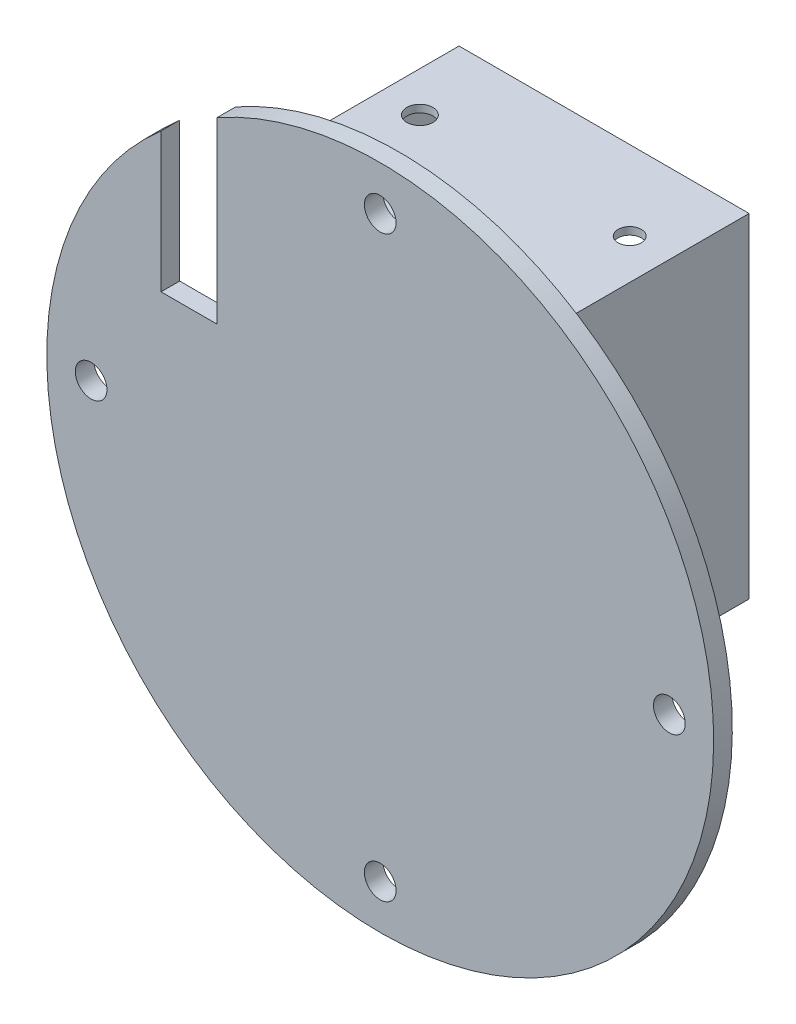
ISO-10303-21;
HEADER;
FILE_DESCRIPTION(('STEP AP214'),'2;1');
FILE_NAME('part.step','',(''),(''),'','','');
FILE_SCHEMA(('AUTOMOTIVE_DESIGN { 1 0 10303 214 1 1 1 1 }'));
ENDSEC;
DATA;
#1=APPLICATION_CONTEXT('core data for automotive mechanical design processes');
#2=APPLICATION_PROTOCOL_DEFINITION('international standard','automotive_design',2000,#1);
#3=PRODUCT_CONTEXT('',#1,'mechanical');
#4=PRODUCT('Part','Part','',(#3));
#5=PRODUCT_RELATED_PRODUCT_CATEGORY('part','',(#4));
#6=PRODUCT_DEFINITION_FORMATION('','',#4);
#7=PRODUCT_DEFINITION_CONTEXT('part definition',#1,'design');
#8=PRODUCT_DEFINITION('design','',#6,#7);
#9=PRODUCT_DEFINITION_SHAPE('','',#8);
#10=(LENGTH_UNIT() NAMED_UNIT(*) SI_UNIT(.MILLI.,.METRE.));
#11=(NAMED_UNIT(*) PLANE_ANGLE_UNIT() SI_UNIT($,.RADIAN.));
#12=(NAMED_UNIT(*) SI_UNIT($,.STERADIAN.) SOLID_ANGLE_UNIT());
#13=UNCERTAINTY_MEASURE_WITH_UNIT(LENGTH_MEASURE(1.E-05),#10,'distance_accuracy_value','');
#14=(GEOMETRIC_REPRESENTATION_CONTEXT(3) GLOBAL_UNCERTAINTY_ASSIGNED_CONTEXT((#13)) GLOBAL_UNIT_ASSIGNED_CONTEXT((#10,
#11,#12)) REPRESENTATION_CONTEXT('',''));
#15=CARTESIAN_POINT('',(0.,0.,0.));
#16=DIRECTION('',(0.,0.,1.));
#17=DIRECTION('',(1.,0.,0.));
#18=AXIS2_PLACEMENT_3D('',#15,#16,#17);
#19=CARTESIAN_POINT('',(0.,0.,0.));
#20=DIRECTION('',(0.,0.,1.));
#21=DIRECTION('',(1.,0.,0.));
#22=AXIS2_PLACEMENT_3D('',#19,#20,#21);
#23=PLANE('',#22);
#24=CARTESIAN_POINT('',(-31.,0.,0.));
#25=DIRECTION('',(0.,0.,1.));
#26=DIRECTION('',(1.,0.,0.));
#27=AXIS2_PLACEMENT_3D('',#24,#25,#26);
#28=CIRCLE('',#27,1.7);
#29=CARTESIAN_POINT('',(-29.3,0.,0.));
#30=VERTEX_POINT('',#29);
#31=EDGE_CURVE('E203',#30,#30,#28,.T.);
#32=ORIENTED_EDGE('',*,*,#31,.T.);
#33=EDGE_LOOP('',(#32));
#34=FACE_BOUND('',#33,.T.);
#35=CARTESIAN_POINT('',(31.,0.,0.));
#36=DIRECTION('',(0.,0.,1.));
#37=DIRECTION('',(1.,0.,0.));
#38=AXIS2_PLACEMENT_3D('',#35,#36,#37);
#39=CIRCLE('',#38,1.7);
#40=CARTESIAN_POINT('',(32.7,0.,0.));
#41=VERTEX_POINT('',#40);
#42=EDGE_CURVE('E199',#41,#41,#39,.F.);
#43=ORIENTED_EDGE('',*,*,#42,.F.);
#44=EDGE_LOOP('',(#43));
#45=FACE_BOUND('',#44,.T.);
#46=CARTESIAN_POINT('',(0.,-31.,0.));
#47=DIRECTION('',(0.,0.,1.));
#48=DIRECTION('',(1.,0.,0.));
#49=AXIS2_PLACEMENT_3D('',#46,#47,#48);
#50=CIRCLE('',#49,1.7);
#51=CARTESIAN_POINT('',(1.70000000000001,-31.,0.));
#52=VERTEX_POINT('',#51);
#53=EDGE_CURVE('E184',#52,#52,#50,.F.);
#54=ORIENTED_EDGE('',*,*,#53,.F.);
#55=EDGE_LOOP('',(#54));
#56=FACE_BOUND('',#55,.T.);
#57=DIRECTION('',(0.,1.,0.));
#58=VECTOR('',#57,1.);
#59=CARTESIAN_POINT('',(-15.55,-9.,0.));
#60=LINE('',#59,#58);
#61=CARTESIAN_POINT('',(-15.55,-9.,0.));
#62=VERTEX_POINT('',#61);
#63=CARTESIAN_POINT('',(-15.55,26.8,0.));
#64=VERTEX_POINT('',#63);
#65=EDGE_CURVE('E275',#62,#64,#60,.T.);
#66=ORIENTED_EDGE('',*,*,#65,.F.);
#67=DIRECTION('',(-1.,0.,0.));
#68=VECTOR('',#67,1.);
#69=CARTESIAN_POINT('',(14.75,-9.00000000000001,0.));
#70=LINE('',#69,#68);
#71=CARTESIAN_POINT('',(15.55,-9.00000000000001,0.));
#72=VERTEX_POINT('',#71);
#73=EDGE_CURVE('E67',#72,#62,#70,.T.);
#74=ORIENTED_EDGE('',*,*,#73,.F.);
#75=DIRECTION('',(0.,-1.,0.));
#76=VECTOR('',#75,1.);
#77=CARTESIAN_POINT('',(15.55,26.8,0.));
#78=LINE('',#77,#76);
#79=CARTESIAN_POINT('',(15.55,26.8,0.));
#80=VERTEX_POINT('',#79);
#81=EDGE_CURVE('E251',#80,#72,#78,.T.);
#82=ORIENTED_EDGE('',*,*,#81,.F.);
#83=DIRECTION('',(1.,0.,0.));
#84=VECTOR('',#83,1.);
#85=CARTESIAN_POINT('',(-15.55,26.8,0.));
#86=LINE('',#85,#84);
#87=EDGE_CURVE('E74',#64,#80,#86,.T.);
#88=ORIENTED_EDGE('',*,*,#87,.F.);
#89=EDGE_LOOP('',(#66,#74,#82,#88));
#90=FACE_BOUND('',#89,.T.);
#91=DIRECTION('',(0.,-1.,0.));
#92=VECTOR('',#91,1.);
#93=CARTESIAN_POINT('',(-17.5,0.,0.));
#94=LINE('',#93,#92);
#95=CARTESIAN_POINT('',(-17.5,31.1739073585587,0.));
#96=VERTEX_POINT('',#95);
#97=CARTESIAN_POINT('',(-17.5,12.,0.));
#98=VERTEX_POINT('',#97);
#99=EDGE_CURVE('E221',#96,#98,#94,.T.);
#100=ORIENTED_EDGE('',*,*,#99,.F.);
#101=CARTESIAN_POINT('',(0.,0.,0.));
#102=DIRECTION('',(0.,0.,1.));
#103=DIRECTION('',(1.,0.,0.));
#104=AXIS2_PLACEMENT_3D('',#101,#102,#103);
#105=CIRCLE('',#104,35.75);
#106=CARTESIAN_POINT('',(-23.5,26.9409075570961,0.));
#107=VERTEX_POINT('',#106);
#108=EDGE_CURVE('E59',#107,#96,#105,.T.);
#109=ORIENTED_EDGE('',*,*,#108,.F.);
#110=DIRECTION('',(0.,1.,0.));
#111=VECTOR('',#110,1.);
#112=CARTESIAN_POINT('',(-23.5,0.,0.));
#113=LINE('',#112,#111);
#114=CARTESIAN_POINT('',(-23.5,12.,0.));
#115=VERTEX_POINT('',#114);
#116=EDGE_CURVE('E176',#115,#107,#113,.T.);
#117=ORIENTED_EDGE('',*,*,#116,.F.);
#118=DIRECTION('',(-1.,0.,0.));
#119=VECTOR('',#118,1.);
#120=CARTESIAN_POINT('',(0.,12.,0.));
#121=LINE('',#120,#119);
#122=EDGE_CURVE('E218',#98,#115,#121,.T.);
#123=ORIENTED_EDGE('',*,*,#122,.F.);
#124=EDGE_LOOP('',(#100,#109,#117,#123));
#125=FACE_BOUND('',#124,.T.);
#126=CARTESIAN_POINT('',(0.,31.,0.));
#127=DIRECTION('',(0.,0.,1.));
#128=DIRECTION('',(1.,0.,0.));
#129=AXIS2_PLACEMENT_3D('',#126,#127,#128);
#130=CIRCLE('',#129,1.7);
#131=CARTESIAN_POINT('',(1.7,31.,0.));
#132=VERTEX_POINT('',#131);
#133=EDGE_CURVE('E154',#132,#132,#130,.T.);
#134=ORIENTED_EDGE('',*,*,#133,.T.);
#135=EDGE_LOOP('',(#134));
#136=FACE_BOUND('',#135,.T.);
#137=ADVANCED_FACE('F49',(#34,#45,#56,#90,#125,#136),#23,.F.);
#138=CARTESIAN_POINT('',(0.,0.,2.));
#139=DIRECTION('',(0.,0.,1.));
#140=DIRECTION('',(1.,0.,0.));
#141=AXIS2_PLACEMENT_3D('',#138,#139,#140);
#142=PLANE('',#141);
#143=CARTESIAN_POINT('',(0.,0.,2.));
#144=DIRECTION('',(0.,0.,1.));
#145=DIRECTION('',(1.,0.,0.));
#146=AXIS2_PLACEMENT_3D('',#143,#144,#145);
#147=CIRCLE('',#146,35.75);
#148=CARTESIAN_POINT('',(-23.5,26.9409075570961,2.));
#149=VERTEX_POINT('',#148);
#150=CARTESIAN_POINT('',(-17.5,31.1739073585587,2.));
#151=VERTEX_POINT('',#150);
#152=EDGE_CURVE('E11',#149,#151,#147,.T.);
#153=ORIENTED_EDGE('',*,*,#152,.T.);
#154=DIRECTION('',(0.,-1.,0.));
#155=VECTOR('',#154,1.);
#156=CARTESIAN_POINT('',(-17.5,22.,2.));
#157=LINE('',#156,#155);
#158=CARTESIAN_POINT('',(-17.5,12.,2.));
#159=VERTEX_POINT('',#158);
#160=EDGE_CURVE('E142',#151,#159,#157,.T.);
#161=ORIENTED_EDGE('',*,*,#160,.T.);
#162=DIRECTION('',(-1.,0.,0.));
#163=VECTOR('',#162,1.);
#164=CARTESIAN_POINT('',(-17.5,12.,2.));
#165=LINE('',#164,#163);
#166=CARTESIAN_POINT('',(-23.5,12.,2.));
#167=VERTEX_POINT('',#166);
#168=EDGE_CURVE('E153',#159,#167,#165,.T.);
#169=ORIENTED_EDGE('',*,*,#168,.T.);
#170=DIRECTION('',(0.,1.,0.));
#171=VECTOR('',#170,1.);
#172=CARTESIAN_POINT('',(-23.5,12.,2.));
#173=LINE('',#172,#171);
#174=EDGE_CURVE('E167',#167,#149,#173,.T.);
#175=ORIENTED_EDGE('',*,*,#174,.T.);
#176=EDGE_LOOP('',(#153,#161,#169,#175));
#177=FACE_BOUND('',#176,.T.);
#178=CARTESIAN_POINT('',(31.,0.,2.));
#179=DIRECTION('',(0.,0.,1.));
#180=DIRECTION('',(1.,0.,0.));
#181=AXIS2_PLACEMENT_3D('',#178,#179,#180);
#182=CIRCLE('',#181,1.7);
#183=CARTESIAN_POINT('',(32.7,0.,2.));
#184=VERTEX_POINT('',#183);
#185=EDGE_CURVE('E189',#184,#184,#182,.F.);
#186=ORIENTED_EDGE('',*,*,#185,.T.);
#187=EDGE_LOOP('',(#186));
#188=FACE_BOUND('',#187,.T.);
#189=CARTESIAN_POINT('',(0.,-31.,2.));
#190=DIRECTION('',(0.,0.,-1.));
#191=DIRECTION('',(-1.,0.,0.));
#192=AXIS2_PLACEMENT_3D('',#189,#190,#191);
#193=CIRCLE('',#192,1.7);
#194=CARTESIAN_POINT('',(-1.69999999999999,-31.,2.));
#195=VERTEX_POINT('',#194);
#196=EDGE_CURVE('E161',#195,#195,#193,.T.);
#197=ORIENTED_EDGE('',*,*,#196,.T.);
#198=EDGE_LOOP('',(#197));
#199=FACE_BOUND('',#198,.T.);
#200=CARTESIAN_POINT('',(-31.,0.,2.));
#201=DIRECTION('',(0.,0.,1.));
#202=DIRECTION('',(1.,0.,0.));
#203=AXIS2_PLACEMENT_3D('',#200,#201,#202);
#204=CIRCLE('',#203,1.7);
#205=CARTESIAN_POINT('',(-29.3,0.,2.));
#206=VERTEX_POINT('',#205);
#207=EDGE_CURVE('E185',#206,#206,#204,.T.);
#208=ORIENTED_EDGE('',*,*,#207,.F.);
#209=EDGE_LOOP('',(#208));
#210=FACE_BOUND('',#209,.T.);
#211=CARTESIAN_POINT('',(0.,31.,2.));
#212=DIRECTION('',(0.,0.,1.));
#213=DIRECTION('',(1.,0.,0.));
#214=AXIS2_PLACEMENT_3D('',#211,#212,#213);
#215=CIRCLE('',#214,1.7);
#216=CARTESIAN_POINT('',(1.7,31.,2.));
#217=VERTEX_POINT('',#216);
#218=EDGE_CURVE('E180',#217,#217,#215,.T.);
#219=ORIENTED_EDGE('',*,*,#218,.F.);
#220=EDGE_LOOP('',(#219));
#221=FACE_BOUND('',#220,.T.);
#222=ADVANCED_FACE('F164',(#177,#188,#199,#210,#221),#142,.T.);
#223=CARTESIAN_POINT('',(0.,0.,2.));
#224=DIRECTION('',(0.,0.,-1.));
#225=DIRECTION('',(-1.,0.,0.));
#226=AXIS2_PLACEMENT_3D('',#223,#224,#225);
#227=CYLINDRICAL_SURFACE('',#226,35.75);
#228=ORIENTED_EDGE('',*,*,#108,.T.);
#229=DIRECTION('',(0.,0.,-1.));
#230=VECTOR('',#229,1.);
#231=CARTESIAN_POINT('',(-17.5,31.1739073585587,2.));
#232=LINE('',#231,#230);
#233=EDGE_CURVE('E145',#96,#151,#232,.F.);
#234=ORIENTED_EDGE('',*,*,#233,.T.);
#235=ORIENTED_EDGE('',*,*,#152,.F.);
#236=DIRECTION('',(0.,0.,-1.));
#237=VECTOR('',#236,1.);
#238=CARTESIAN_POINT('',(-23.5,26.9409075570961,2.));
#239=LINE('',#238,#237);
#240=EDGE_CURVE('E162',#149,#107,#239,.T.);
#241=ORIENTED_EDGE('',*,*,#240,.T.);
#242=EDGE_LOOP('',(#228,#234,#235,#241));
#243=FACE_BOUND('',#242,.T.);
#244=ADVANCED_FACE('F51',(#243),#227,.T.);
#245=CARTESIAN_POINT('',(14.75,-9.00000000000001,-22.));
#246=DIRECTION('',(0.,1.,0.));
#247=DIRECTION('',(0.,0.,1.));
#248=AXIS2_PLACEMENT_3D('',#245,#246,#247);
#249=PLANE('',#248);
#250=ORIENTED_EDGE('',*,*,#73,.T.);
#251=DIRECTION('',(0.,0.,1.));
#252=VECTOR('',#251,1.);
#253=CARTESIAN_POINT('',(-15.55,-9.,-22.));
#254=LINE('',#253,#252);
#255=CARTESIAN_POINT('',(-15.55,-9.,-22.));
#256=VERTEX_POINT('',#255);
#257=EDGE_CURVE('E293',#256,#62,#254,.T.);
#258=ORIENTED_EDGE('',*,*,#257,.F.);
#259=DIRECTION('',(-1.,0.,0.));
#260=VECTOR('',#259,1.);
#261=CARTESIAN_POINT('',(-14.75,-9.,-22.));
#262=LINE('',#261,#260);
#263=CARTESIAN_POINT('',(-14.75,-9.,-22.));
#264=VERTEX_POINT('',#263);
#265=EDGE_CURVE('E260',#264,#256,#262,.T.);
#266=ORIENTED_EDGE('',*,*,#265,.F.);
#267=DIRECTION('',(0.,0.,1.));
#268=VECTOR('',#267,1.);
#269=CARTESIAN_POINT('',(-14.75,-9.,-22.));
#270=LINE('',#269,#268);
#271=CARTESIAN_POINT('',(-14.75,-9.,-10.));
#272=VERTEX_POINT('',#271);
#273=EDGE_CURVE('E297',#264,#272,#270,.T.);
#274=ORIENTED_EDGE('',*,*,#273,.T.);
#275=DIRECTION('',(-1.,0.,0.));
#276=VECTOR('',#275,1.);
#277=CARTESIAN_POINT('',(14.75,-9.,-10.));
#278=LINE('',#277,#276);
#279=CARTESIAN_POINT('',(14.75,-9.,-10.));
#280=VERTEX_POINT('',#279);
#281=EDGE_CURVE('E237',#280,#272,#278,.T.);
#282=ORIENTED_EDGE('',*,*,#281,.F.);
#283=DIRECTION('',(0.,0.,1.));
#284=VECTOR('',#283,1.);
#285=CARTESIAN_POINT('',(14.75,-9.00000000000001,-22.));
#286=LINE('',#285,#284);
#287=CARTESIAN_POINT('',(14.75,-9.00000000000001,-22.));
#288=VERTEX_POINT('',#287);
#289=EDGE_CURVE('E309',#288,#280,#286,.T.);
#290=ORIENTED_EDGE('',*,*,#289,.F.);
#291=DIRECTION('',(-1.,0.,0.));
#292=VECTOR('',#291,1.);
#293=CARTESIAN_POINT('',(14.75,-9.00000000000001,-22.));
#294=LINE('',#293,#292);
#295=CARTESIAN_POINT('',(15.55,-9.00000000000001,-22.));
#296=VERTEX_POINT('',#295);
#297=EDGE_CURVE('E246',#296,#288,#294,.T.);
#298=ORIENTED_EDGE('',*,*,#297,.F.);
#299=DIRECTION('',(0.,0.,1.));
#300=VECTOR('',#299,1.);
#301=CARTESIAN_POINT('',(15.55,-9.00000000000001,-22.));
#302=LINE('',#301,#300);
#303=EDGE_CURVE('E272',#296,#72,#302,.T.);
#304=ORIENTED_EDGE('',*,*,#303,.T.);
#305=EDGE_LOOP('',(#250,#258,#266,#274,#282,#290,#298,#304));
#306=FACE_BOUND('',#305,.T.);
#307=ADVANCED_FACE('F348',(#306),#249,.F.);
#308=CARTESIAN_POINT('',(14.75,26.,-22.));
#309=DIRECTION('',(1.,0.,0.));
#310=DIRECTION('',(0.,1.,0.));
#311=AXIS2_PLACEMENT_3D('',#308,#309,#310);
#312=PLANE('',#311);
#313=ORIENTED_EDGE('',*,*,#289,.T.);
#314=DIRECTION('',(0.,-1.,0.));
#315=VECTOR('',#314,1.);
#316=CARTESIAN_POINT('',(14.75,26.,-10.));
#317=LINE('',#316,#315);
#318=CARTESIAN_POINT('',(14.75,26.,-10.));
#319=VERTEX_POINT('',#318);
#320=EDGE_CURVE('E233',#319,#280,#317,.T.);
#321=ORIENTED_EDGE('',*,*,#320,.F.);
#322=DIRECTION('',(0.,0.,1.));
#323=VECTOR('',#322,1.);
#324=CARTESIAN_POINT('',(14.75,26.,-22.));
#325=LINE('',#324,#323);
#326=CARTESIAN_POINT('',(14.75,26.,-22.));
#327=VERTEX_POINT('',#326);
#328=EDGE_CURVE('E305',#327,#319,#325,.T.);
#329=ORIENTED_EDGE('',*,*,#328,.F.);
#330=DIRECTION('',(0.,1.,0.));
#331=VECTOR('',#330,1.);
#332=CARTESIAN_POINT('',(14.75,26.,-22.));
#333=LINE('',#332,#331);
#334=EDGE_CURVE('E250',#288,#327,#333,.T.);
#335=ORIENTED_EDGE('',*,*,#334,.F.);
#336=EDGE_LOOP('',(#313,#321,#329,#335));
#337=FACE_BOUND('',#336,.T.);
#338=ADVANCED_FACE('F351',(#337),#312,.F.);
#339=CARTESIAN_POINT('',(-14.75,26.,-22.));
#340=DIRECTION('',(0.,1.,0.));
#341=DIRECTION('',(-1.,0.,0.));
#342=AXIS2_PLACEMENT_3D('',#339,#340,#341);
#343=PLANE('',#342);
#344=CARTESIAN_POINT('',(-11.25,26.,-13.5));
#345=DIRECTION('',(0.,-1.,0.));
#346=DIRECTION('',(1.,0.,0.));
#347=AXIS2_PLACEMENT_3D('',#344,#345,#346);
#348=CIRCLE('',#347,1.4);
#349=CARTESIAN_POINT('',(-9.84999999999999,26.,-13.5));
#350=VERTEX_POINT('',#349);
#351=EDGE_CURVE('E225',#350,#350,#348,.T.);
#352=ORIENTED_EDGE('',*,*,#351,.F.);
#353=EDGE_LOOP('',(#352));
#354=FACE_BOUND('',#353,.T.);
#355=CARTESIAN_POINT('',(11.25,26.,-13.5));
#356=DIRECTION('',(0.,-1.,0.));
#357=DIRECTION('',(1.,0.,0.));
#358=AXIS2_PLACEMENT_3D('',#355,#356,#357);
#359=CIRCLE('',#358,1.25);
#360=CARTESIAN_POINT('',(12.5,26.,-13.5));
#361=VERTEX_POINT('',#360);
#362=EDGE_CURVE('E224',#361,#361,#359,.T.);
#363=ORIENTED_EDGE('',*,*,#362,.F.);
#364=EDGE_LOOP('',(#363));
#365=FACE_BOUND('',#364,.T.);
#366=ORIENTED_EDGE('',*,*,#328,.T.);
#367=DIRECTION('',(1.,0.,0.));
#368=VECTOR('',#367,1.);
#369=CARTESIAN_POINT('',(14.75,26.,-10.));
#370=LINE('',#369,#368);
#371=CARTESIAN_POINT('',(-14.75,26.,-10.));
#372=VERTEX_POINT('',#371);
#373=EDGE_CURVE('E243',#372,#319,#370,.T.);
#374=ORIENTED_EDGE('',*,*,#373,.F.);
#375=DIRECTION('',(0.,0.,1.));
#376=VECTOR('',#375,1.);
#377=CARTESIAN_POINT('',(-14.75,26.,-22.));
#378=LINE('',#377,#376);
#379=CARTESIAN_POINT('',(-14.75,26.,-22.));
#380=VERTEX_POINT('',#379);
#381=EDGE_CURVE('E301',#380,#372,#378,.T.);
#382=ORIENTED_EDGE('',*,*,#381,.F.);
#383=DIRECTION('',(-1.,0.,0.));
#384=VECTOR('',#383,1.);
#385=CARTESIAN_POINT('',(-14.75,26.,-22.));
#386=LINE('',#385,#384);
#387=EDGE_CURVE('E254',#327,#380,#386,.T.);
#388=ORIENTED_EDGE('',*,*,#387,.F.);
#389=EDGE_LOOP('',(#366,#374,#382,#388));
#390=FACE_BOUND('',#389,.T.);
#391=ADVANCED_FACE('F354',(#354,#365,#390),#343,.F.);
#392=CARTESIAN_POINT('',(-14.75,26.,-22.));
#393=DIRECTION('',(-1.,0.,0.));
#394=DIRECTION('',(0.,-1.,0.));
#395=AXIS2_PLACEMENT_3D('',#392,#393,#394);
#396=PLANE('',#395);
#397=ORIENTED_EDGE('',*,*,#381,.T.);
#398=DIRECTION('',(0.,1.,0.));
#399=VECTOR('',#398,1.);
#400=CARTESIAN_POINT('',(-14.75,26.,-10.));
#401=LINE('',#400,#399);
#402=EDGE_CURVE('E240',#272,#372,#401,.T.);
#403=ORIENTED_EDGE('',*,*,#402,.F.);
#404=ORIENTED_EDGE('',*,*,#273,.F.);
#405=DIRECTION('',(0.,-1.,0.));
#406=VECTOR('',#405,1.);
#407=CARTESIAN_POINT('',(-14.75,26.,-22.));
#408=LINE('',#407,#406);
#409=EDGE_CURVE('E257',#380,#264,#408,.T.);
#410=ORIENTED_EDGE('',*,*,#409,.F.);
#411=EDGE_LOOP('',(#397,#403,#404,#410));
#412=FACE_BOUND('',#411,.T.);
#413=ADVANCED_FACE('F358',(#412),#396,.F.);
#414=CARTESIAN_POINT('',(-15.55,-9.,-22.));
#415=DIRECTION('',(1.,0.,0.));
#416=DIRECTION('',(0.,0.,-1.));
#417=AXIS2_PLACEMENT_3D('',#414,#415,#416);
#418=PLANE('',#417);
#419=ORIENTED_EDGE('',*,*,#65,.T.);
#420=DIRECTION('',(0.,0.,1.));
#421=VECTOR('',#420,1.);
#422=CARTESIAN_POINT('',(-15.55,26.8,-22.));
#423=LINE('',#422,#421);
#424=CARTESIAN_POINT('',(-15.55,26.8,-22.));
#425=VERTEX_POINT('',#424);
#426=EDGE_CURVE('E289',#425,#64,#423,.T.);
#427=ORIENTED_EDGE('',*,*,#426,.F.);
#428=DIRECTION('',(0.,1.,0.));
#429=VECTOR('',#428,1.);
#430=CARTESIAN_POINT('',(-15.55,-9.,-22.));
#431=LINE('',#430,#429);
#432=EDGE_CURVE('E263',#256,#425,#431,.T.);
#433=ORIENTED_EDGE('',*,*,#432,.F.);
#434=ORIENTED_EDGE('',*,*,#257,.T.);
#435=EDGE_LOOP('',(#419,#427,#433,#434));
#436=FACE_BOUND('',#435,.T.);
#437=ADVANCED_FACE('F362',(#436),#418,.F.);
#438=CARTESIAN_POINT('',(-15.55,26.8,-22.));
#439=DIRECTION('',(0.,-1.,0.));
#440=DIRECTION('',(1.,0.,0.));
#441=AXIS2_PLACEMENT_3D('',#438,#439,#440);
#442=PLANE('',#441);
#443=CARTESIAN_POINT('',(-11.25,26.8,-13.5));
#444=DIRECTION('',(0.,-1.,0.));
#445=DIRECTION('',(1.,0.,0.));
#446=AXIS2_PLACEMENT_3D('',#443,#444,#445);
#447=CIRCLE('',#446,1.4);
#448=CARTESIAN_POINT('',(-9.84999999999999,26.8,-13.5));
#449=VERTEX_POINT('',#448);
#450=EDGE_CURVE('E53',#449,#449,#447,.T.);
#451=ORIENTED_EDGE('',*,*,#450,.T.);
#452=EDGE_LOOP('',(#451));
#453=FACE_BOUND('',#452,.T.);
#454=CARTESIAN_POINT('',(11.25,26.8,-13.5));
#455=DIRECTION('',(0.,-1.,0.));
#456=DIRECTION('',(1.,0.,0.));
#457=AXIS2_PLACEMENT_3D('',#454,#455,#456);
#458=CIRCLE('',#457,1.25);
#459=CARTESIAN_POINT('',(12.5,26.8,-13.5));
#460=VERTEX_POINT('',#459);
#461=EDGE_CURVE('E229',#460,#460,#458,.T.);
#462=ORIENTED_EDGE('',*,*,#461,.T.);
#463=EDGE_LOOP('',(#462));
#464=FACE_BOUND('',#463,.T.);
#465=ORIENTED_EDGE('',*,*,#87,.T.);
#466=DIRECTION('',(0.,0.,1.));
#467=VECTOR('',#466,1.);
#468=CARTESIAN_POINT('',(15.55,26.8,-22.));
#469=LINE('',#468,#467);
#470=CARTESIAN_POINT('',(15.55,26.8,-22.));
#471=VERTEX_POINT('',#470);
#472=EDGE_CURVE('E285',#471,#80,#469,.T.);
#473=ORIENTED_EDGE('',*,*,#472,.F.);
#474=DIRECTION('',(1.,0.,0.));
#475=VECTOR('',#474,1.);
#476=CARTESIAN_POINT('',(-15.55,26.8,-22.));
#477=LINE('',#476,#475);
#478=EDGE_CURVE('E266',#425,#471,#477,.T.);
#479=ORIENTED_EDGE('',*,*,#478,.F.);
#480=ORIENTED_EDGE('',*,*,#426,.T.);
#481=EDGE_LOOP('',(#465,#473,#479,#480));
#482=FACE_BOUND('',#481,.T.);
#483=ADVANCED_FACE('F322',(#453,#464,#482),#442,.F.);
#484=CARTESIAN_POINT('',(15.55,26.8,-22.));
#485=DIRECTION('',(-1.,0.,0.));
#486=DIRECTION('',(0.,-1.,0.));
#487=AXIS2_PLACEMENT_3D('',#484,#485,#486);
#488=PLANE('',#487);
#489=ORIENTED_EDGE('',*,*,#81,.T.);
#490=ORIENTED_EDGE('',*,*,#303,.F.);
#491=DIRECTION('',(0.,-1.,0.));
#492=VECTOR('',#491,1.);
#493=CARTESIAN_POINT('',(15.55,26.8,-22.));
#494=LINE('',#493,#492);
#495=EDGE_CURVE('E269',#471,#296,#494,.T.);
#496=ORIENTED_EDGE('',*,*,#495,.F.);
#497=ORIENTED_EDGE('',*,*,#472,.T.);
#498=EDGE_LOOP('',(#489,#490,#496,#497));
#499=FACE_BOUND('',#498,.T.);
#500=ADVANCED_FACE('F369',(#499),#488,.F.);
#501=CARTESIAN_POINT('',(0.,0.,-22.));
#502=DIRECTION('',(0.,0.,-1.));
#503=DIRECTION('',(-1.,0.,0.));
#504=AXIS2_PLACEMENT_3D('',#501,#502,#503);
#505=PLANE('',#504);
#506=ORIENTED_EDGE('',*,*,#297,.T.);
#507=ORIENTED_EDGE('',*,*,#334,.T.);
#508=ORIENTED_EDGE('',*,*,#387,.T.);
#509=ORIENTED_EDGE('',*,*,#409,.T.);
#510=ORIENTED_EDGE('',*,*,#265,.T.);
#511=ORIENTED_EDGE('',*,*,#432,.T.);
#512=ORIENTED_EDGE('',*,*,#478,.T.);
#513=ORIENTED_EDGE('',*,*,#495,.T.);
#514=EDGE_LOOP('',(#506,#507,#508,#509,#510,#511,#512,#513));
#515=FACE_BOUND('',#514,.T.);
#516=ADVANCED_FACE('F372',(#515),#505,.T.);
#517=CARTESIAN_POINT('',(0.,0.,-10.));
#518=DIRECTION('',(0.,0.,-1.));
#519=DIRECTION('',(-1.,0.,0.));
#520=AXIS2_PLACEMENT_3D('',#517,#518,#519);
#521=PLANE('',#520);
#522=ORIENTED_EDGE('',*,*,#320,.T.);
#523=ORIENTED_EDGE('',*,*,#281,.T.);
#524=ORIENTED_EDGE('',*,*,#402,.T.);
#525=ORIENTED_EDGE('',*,*,#373,.T.);
#526=EDGE_LOOP('',(#522,#523,#524,#525));
#527=FACE_BOUND('',#526,.T.);
#528=ADVANCED_FACE('F336',(#527),#521,.T.);
#529=CARTESIAN_POINT('',(11.25,28.,-13.5));
#530=DIRECTION('',(0.,-1.,0.));
#531=DIRECTION('',(1.,0.,0.));
#532=AXIS2_PLACEMENT_3D('',#529,#530,#531);
#533=CYLINDRICAL_SURFACE('',#532,1.25);
#534=ORIENTED_EDGE('',*,*,#362,.T.);
#535=EDGE_LOOP('',(#534));
#536=FACE_BOUND('',#535,.T.);
#537=ORIENTED_EDGE('',*,*,#461,.F.);
#538=EDGE_LOOP('',(#537));
#539=FACE_BOUND('',#538,.T.);
#540=ADVANCED_FACE('F326',(#536,#539),#533,.F.);
#541=CARTESIAN_POINT('',(-11.25,28.,-13.5));
#542=DIRECTION('',(0.,-1.,0.));
#543=DIRECTION('',(1.,0.,0.));
#544=AXIS2_PLACEMENT_3D('',#541,#542,#543);
#545=CYLINDRICAL_SURFACE('',#544,1.4);
#546=ORIENTED_EDGE('',*,*,#351,.T.);
#547=EDGE_LOOP('',(#546));
#548=FACE_BOUND('',#547,.T.);
#549=ORIENTED_EDGE('',*,*,#450,.F.);
#550=EDGE_LOOP('',(#549));
#551=FACE_BOUND('',#550,.T.);
#552=ADVANCED_FACE('F324',(#548,#551),#545,.F.);
#553=CARTESIAN_POINT('',(-17.5,22.,-8.));
#554=DIRECTION('',(-1.,0.,0.));
#555=DIRECTION('',(0.,-1.,0.));
#556=AXIS2_PLACEMENT_3D('',#553,#554,#555);
#557=PLANE('',#556);
#558=ORIENTED_EDGE('',*,*,#99,.T.);
#559=DIRECTION('',(0.,0.,1.));
#560=VECTOR('',#559,1.);
#561=CARTESIAN_POINT('',(-17.5,12.,-8.));
#562=LINE('',#561,#560);
#563=EDGE_CURVE('E148',#98,#159,#562,.T.);
#564=ORIENTED_EDGE('',*,*,#563,.T.);
#565=ORIENTED_EDGE('',*,*,#160,.F.);
#566=ORIENTED_EDGE('',*,*,#233,.F.);
#567=EDGE_LOOP('',(#558,#564,#565,#566));
#568=FACE_BOUND('',#567,.T.);
#569=ADVANCED_FACE('F144',(#568),#557,.T.);
#570=CARTESIAN_POINT('',(-17.5,12.,-8.));
#571=DIRECTION('',(0.,1.,0.));
#572=DIRECTION('',(0.,0.,1.));
#573=AXIS2_PLACEMENT_3D('',#570,#571,#572);
#574=PLANE('',#573);
#575=ORIENTED_EDGE('',*,*,#122,.T.);
#576=DIRECTION('',(0.,0.,1.));
#577=VECTOR('',#576,1.);
#578=CARTESIAN_POINT('',(-23.5,12.,-8.));
#579=LINE('',#578,#577);
#580=EDGE_CURVE('E172',#115,#167,#579,.T.);
#581=ORIENTED_EDGE('',*,*,#580,.T.);
#582=ORIENTED_EDGE('',*,*,#168,.F.);
#583=ORIENTED_EDGE('',*,*,#563,.F.);
#584=EDGE_LOOP('',(#575,#581,#582,#583));
#585=FACE_BOUND('',#584,.T.);
#586=ADVANCED_FACE('F334',(#585),#574,.T.);
#587=CARTESIAN_POINT('',(-23.5,12.,-8.));
#588=DIRECTION('',(1.,0.,0.));
#589=DIRECTION('',(0.,0.,-1.));
#590=AXIS2_PLACEMENT_3D('',#587,#588,#589);
#591=PLANE('',#590);
#592=ORIENTED_EDGE('',*,*,#116,.T.);
#593=ORIENTED_EDGE('',*,*,#240,.F.);
#594=ORIENTED_EDGE('',*,*,#174,.F.);
#595=ORIENTED_EDGE('',*,*,#580,.F.);
#596=EDGE_LOOP('',(#592,#593,#594,#595));
#597=FACE_BOUND('',#596,.T.);
#598=ADVANCED_FACE('F174',(#597),#591,.T.);
#599=CARTESIAN_POINT('',(0.,-31.,-32.));
#600=DIRECTION('',(0.,0.,1.));
#601=DIRECTION('',(1.,0.,0.));
#602=AXIS2_PLACEMENT_3D('',#599,#600,#601);
#603=CYLINDRICAL_SURFACE('',#602,1.7);
#604=ORIENTED_EDGE('',*,*,#196,.F.);
#605=EDGE_LOOP('',(#604));
#606=FACE_BOUND('',#605,.T.);
#607=ORIENTED_EDGE('',*,*,#53,.T.);
#608=EDGE_LOOP('',(#607));
#609=FACE_BOUND('',#608,.T.);
#610=ADVANCED_FACE('F418',(#606,#609),#603,.F.);
#611=CARTESIAN_POINT('',(31.,0.,-32.));
#612=DIRECTION('',(0.,0.,1.));
#613=DIRECTION('',(1.,0.,0.));
#614=AXIS2_PLACEMENT_3D('',#611,#612,#613);
#615=CYLINDRICAL_SURFACE('',#614,1.7);
#616=ORIENTED_EDGE('',*,*,#185,.F.);
#617=EDGE_LOOP('',(#616));
#618=FACE_BOUND('',#617,.T.);
#619=ORIENTED_EDGE('',*,*,#42,.T.);
#620=EDGE_LOOP('',(#619));
#621=FACE_BOUND('',#620,.T.);
#622=ADVANCED_FACE('F412',(#618,#621),#615,.F.);
#623=CARTESIAN_POINT('',(-31.,0.,-32.));
#624=DIRECTION('',(0.,0.,1.));
#625=DIRECTION('',(1.,0.,0.));
#626=AXIS2_PLACEMENT_3D('',#623,#624,#625);
#627=CYLINDRICAL_SURFACE('',#626,1.7);
#628=ORIENTED_EDGE('',*,*,#207,.T.);
#629=EDGE_LOOP('',(#628));
#630=FACE_BOUND('',#629,.T.);
#631=ORIENTED_EDGE('',*,*,#31,.F.);
#632=EDGE_LOOP('',(#631));
#633=FACE_BOUND('',#632,.T.);
#634=ADVANCED_FACE('F406',(#630,#633),#627,.F.);
#635=CARTESIAN_POINT('',(0.,31.,-32.));
#636=DIRECTION('',(0.,0.,1.));
#637=DIRECTION('',(1.,0.,0.));
#638=AXIS2_PLACEMENT_3D('',#635,#636,#637);
#639=CYLINDRICAL_SURFACE('',#638,1.7);
#640=ORIENTED_EDGE('',*,*,#218,.T.);
#641=EDGE_LOOP('',(#640));
#642=FACE_BOUND('',#641,.T.);
#643=ORIENTED_EDGE('',*,*,#133,.F.);
#644=EDGE_LOOP('',(#643));
#645=FACE_BOUND('',#644,.T.);
#646=ADVANCED_FACE('F405',(#642,#645),#639,.F.);
#647=CLOSED_SHELL('',(#137,#222,#244,#307,#338,#391,#413,#437,#483,#500,#516,#528,#540,#552,
#569,#586,#598,#610,#622,#634,#646));
#648=MANIFOLD_SOLID_BREP('B2',#647);
#649=ADVANCED_BREP_SHAPE_REPRESENTATION('',(#18,#648),#14);
#650=SHAPE_DEFINITION_REPRESENTATION(#9,#649);
ENDSEC;
END-ISO-10303-21;
